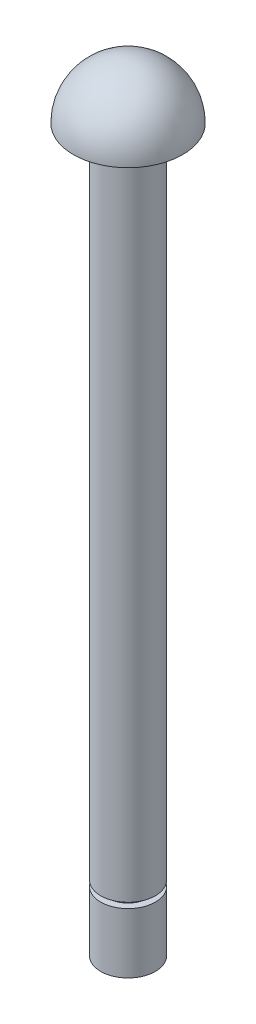
ISO-10303-21;
HEADER;
FILE_DESCRIPTION(('STEP AP214'),'2;1');
FILE_NAME('part.step','',(''),(''),'','','');
FILE_SCHEMA(('AUTOMOTIVE_DESIGN { 1 0 10303 214 1 1 1 1 }'));
ENDSEC;
DATA;
#1=APPLICATION_CONTEXT('core data for automotive mechanical design processes');
#2=APPLICATION_PROTOCOL_DEFINITION('international standard','automotive_design',2000,#1);
#3=PRODUCT_CONTEXT('',#1,'mechanical');
#4=PRODUCT('Part','Part','',(#3));
#5=PRODUCT_RELATED_PRODUCT_CATEGORY('part','',(#4));
#6=PRODUCT_DEFINITION_FORMATION('','',#4);
#7=PRODUCT_DEFINITION_CONTEXT('part definition',#1,'design');
#8=PRODUCT_DEFINITION('design','',#6,#7);
#9=PRODUCT_DEFINITION_SHAPE('','',#8);
#10=(LENGTH_UNIT() NAMED_UNIT(*) SI_UNIT(.MILLI.,.METRE.));
#11=(NAMED_UNIT(*) PLANE_ANGLE_UNIT() SI_UNIT($,.RADIAN.));
#12=(NAMED_UNIT(*) SI_UNIT($,.STERADIAN.) SOLID_ANGLE_UNIT());
#13=UNCERTAINTY_MEASURE_WITH_UNIT(LENGTH_MEASURE(1.E-05),#10,'distance_accuracy_value','');
#14=(GEOMETRIC_REPRESENTATION_CONTEXT(3) GLOBAL_UNCERTAINTY_ASSIGNED_CONTEXT((#13)) GLOBAL_UNIT_ASSIGNED_CONTEXT((#10,
#11,#12)) REPRESENTATION_CONTEXT('',''));
#15=CARTESIAN_POINT('',(0.,0.,0.));
#16=DIRECTION('',(0.,0.,1.));
#17=DIRECTION('',(1.,0.,0.));
#18=AXIS2_PLACEMENT_3D('',#15,#16,#17);
#19=CARTESIAN_POINT('',(0.,66.,0.));
#20=DIRECTION('',(0.,-1.,0.));
#21=DIRECTION('',(0.,0.,-1.));
#22=AXIS2_PLACEMENT_3D('',#19,#20,#21);
#23=CYLINDRICAL_SURFACE('',#22,2.5);
#24=CARTESIAN_POINT('',(0.,6.00000000000001,0.));
#25=DIRECTION('',(0.,1.,0.));
#26=DIRECTION('',(0.,0.,1.));
#27=AXIS2_PLACEMENT_3D('',#24,#25,#26);
#28=CIRCLE('',#27,2.5);
#29=CARTESIAN_POINT('',(0.,6.00000000000001,2.5));
#30=VERTEX_POINT('',#29);
#31=EDGE_CURVE('E66',#30,#30,#28,.T.);
#32=ORIENTED_EDGE('',*,*,#31,.T.);
#33=EDGE_LOOP('',(#32));
#34=FACE_BOUND('',#33,.T.);
#35=CARTESIAN_POINT('',(0.,66.,0.));
#36=DIRECTION('',(0.,1.,0.));
#37=DIRECTION('',(0.,0.,1.));
#38=AXIS2_PLACEMENT_3D('',#35,#36,#37);
#39=CIRCLE('',#38,2.5);
#40=CARTESIAN_POINT('',(0.,66.,2.5));
#41=VERTEX_POINT('',#40);
#42=EDGE_CURVE('E10',#41,#41,#39,.T.);
#43=ORIENTED_EDGE('',*,*,#42,.F.);
#44=EDGE_LOOP('',(#43));
#45=FACE_BOUND('',#44,.T.);
#46=ADVANCED_FACE('F37',(#34,#45),#23,.T.);
#47=CARTESIAN_POINT('',(0.,66.,0.));
#48=DIRECTION('',(0.,-1.,0.));
#49=DIRECTION('',(0.,0.,-1.));
#50=AXIS2_PLACEMENT_3D('',#47,#48,#49);
#51=PLANE('',#50);
#52=ORIENTED_EDGE('',*,*,#42,.T.);
#53=EDGE_LOOP('',(#52));
#54=FACE_BOUND('',#53,.T.);
#55=CARTESIAN_POINT('',(0.,66.,0.));
#56=DIRECTION('',(0.,-1.,0.));
#57=DIRECTION('',(0.,0.,-1.));
#58=AXIS2_PLACEMENT_3D('',#55,#56,#57);
#59=CIRCLE('',#58,5.);
#60=CARTESIAN_POINT('',(0.,66.,-5.));
#61=VERTEX_POINT('',#60);
#62=EDGE_CURVE('E49',#61,#61,#59,.T.);
#63=ORIENTED_EDGE('',*,*,#62,.T.);
#64=EDGE_LOOP('',(#63));
#65=FACE_BOUND('',#64,.T.);
#66=ADVANCED_FACE('F103',(#54,#65),#51,.T.);
#67=CARTESIAN_POINT('',(0.,66.,0.));
#68=DIRECTION('',(0.,-1.,0.));
#69=DIRECTION('',(0.,0.,-1.));
#70=AXIS2_PLACEMENT_3D('',#67,#68,#69);
#71=SPHERICAL_SURFACE('',#70,5.);
#72=ORIENTED_EDGE('',*,*,#62,.F.);
#73=EDGE_LOOP('',(#72));
#74=FACE_BOUND('',#73,.T.);
#75=ADVANCED_FACE('F89',(#74),#71,.T.);
#76=CARTESIAN_POINT('',(0.,5.50000000000001,-2.5));
#77=DIRECTION('',(0.,-1.,0.));
#78=DIRECTION('',(0.,0.,-1.));
#79=AXIS2_PLACEMENT_3D('',#76,#77,#78);
#80=PLANE('',#79);
#81=CARTESIAN_POINT('',(0.,5.50000000000001,0.));
#82=DIRECTION('',(0.,1.,0.));
#83=DIRECTION('',(0.,0.,1.));
#84=AXIS2_PLACEMENT_3D('',#81,#82,#83);
#85=CIRCLE('',#84,1.875);
#86=CARTESIAN_POINT('',(0.,5.50000000000001,1.875));
#87=VERTEX_POINT('',#86);
#88=EDGE_CURVE('E58',#87,#87,#85,.T.);
#89=ORIENTED_EDGE('',*,*,#88,.F.);
#90=EDGE_LOOP('',(#89));
#91=FACE_BOUND('',#90,.T.);
#92=CARTESIAN_POINT('',(0.,5.50000000000001,0.));
#93=DIRECTION('',(0.,1.,0.));
#94=DIRECTION('',(0.,0.,1.));
#95=AXIS2_PLACEMENT_3D('',#92,#93,#94);
#96=CIRCLE('',#95,2.5);
#97=CARTESIAN_POINT('',(0.,5.50000000000001,2.5));
#98=VERTEX_POINT('',#97);
#99=EDGE_CURVE('E54',#98,#98,#96,.T.);
#100=ORIENTED_EDGE('',*,*,#99,.T.);
#101=EDGE_LOOP('',(#100));
#102=FACE_BOUND('',#101,.T.);
#103=ADVANCED_FACE('F83',(#91,#102),#80,.F.);
#104=CARTESIAN_POINT('',(0.,66.,0.));
#105=DIRECTION('',(0.,1.,0.));
#106=DIRECTION('',(0.,0.,1.));
#107=AXIS2_PLACEMENT_3D('',#104,#105,#106);
#108=CYLINDRICAL_SURFACE('',#107,1.875);
#109=CARTESIAN_POINT('',(0.,6.00000000000001,0.));
#110=DIRECTION('',(0.,1.,0.));
#111=DIRECTION('',(0.,0.,1.));
#112=AXIS2_PLACEMENT_3D('',#109,#110,#111);
#113=CIRCLE('',#112,1.875);
#114=CARTESIAN_POINT('',(0.,6.00000000000001,1.875));
#115=VERTEX_POINT('',#114);
#116=EDGE_CURVE('E62',#115,#115,#113,.T.);
#117=ORIENTED_EDGE('',*,*,#116,.F.);
#118=EDGE_LOOP('',(#117));
#119=FACE_BOUND('',#118,.T.);
#120=ORIENTED_EDGE('',*,*,#88,.T.);
#121=EDGE_LOOP('',(#120));
#122=FACE_BOUND('',#121,.T.);
#123=ADVANCED_FACE('F77',(#119,#122),#108,.T.);
#124=CARTESIAN_POINT('',(0.,6.00000000000001,-1.875));
#125=DIRECTION('',(0.,1.,0.));
#126=DIRECTION('',(0.,0.,1.));
#127=AXIS2_PLACEMENT_3D('',#124,#125,#126);
#128=PLANE('',#127);
#129=ORIENTED_EDGE('',*,*,#31,.F.);
#130=EDGE_LOOP('',(#129));
#131=FACE_BOUND('',#130,.T.);
#132=ORIENTED_EDGE('',*,*,#116,.T.);
#133=EDGE_LOOP('',(#132));
#134=FACE_BOUND('',#133,.T.);
#135=ADVANCED_FACE('F73',(#131,#134),#128,.F.);
#136=CARTESIAN_POINT('',(0.,0.,0.));
#137=DIRECTION('',(0.,1.,0.));
#138=DIRECTION('',(0.,0.,1.));
#139=AXIS2_PLACEMENT_3D('',#136,#137,#138);
#140=PLANE('',#139);
#141=CARTESIAN_POINT('',(0.,0.,0.));
#142=DIRECTION('',(0.,1.,0.));
#143=DIRECTION('',(0.,0.,1.));
#144=AXIS2_PLACEMENT_3D('',#141,#142,#143);
#145=CIRCLE('',#144,2.5);
#146=CARTESIAN_POINT('',(0.,0.,2.5));
#147=VERTEX_POINT('',#146);
#148=EDGE_CURVE('E40',#147,#147,#145,.T.);
#149=ORIENTED_EDGE('',*,*,#148,.F.);
#150=EDGE_LOOP('',(#149));
#151=FACE_BOUND('',#150,.T.);
#152=ADVANCED_FACE('F76',(#151),#140,.F.);
#153=ORIENTED_EDGE('',*,*,#99,.F.);
#154=EDGE_LOOP('',(#153));
#155=FACE_BOUND('',#154,.T.);
#156=ORIENTED_EDGE('',*,*,#148,.T.);
#157=EDGE_LOOP('',(#156));
#158=FACE_BOUND('',#157,.T.);
#159=ADVANCED_FACE('F93',(#155,#158),#23,.T.);
#160=CLOSED_SHELL('',(#46,#66,#75,#103,#123,#135,#152,#159));
#161=MANIFOLD_SOLID_BREP('B2',#160);
#162=ADVANCED_BREP_SHAPE_REPRESENTATION('',(#18,#161),#14);
#163=SHAPE_DEFINITION_REPRESENTATION(#9,#162);
ENDSEC;
END-ISO-10303-21;
